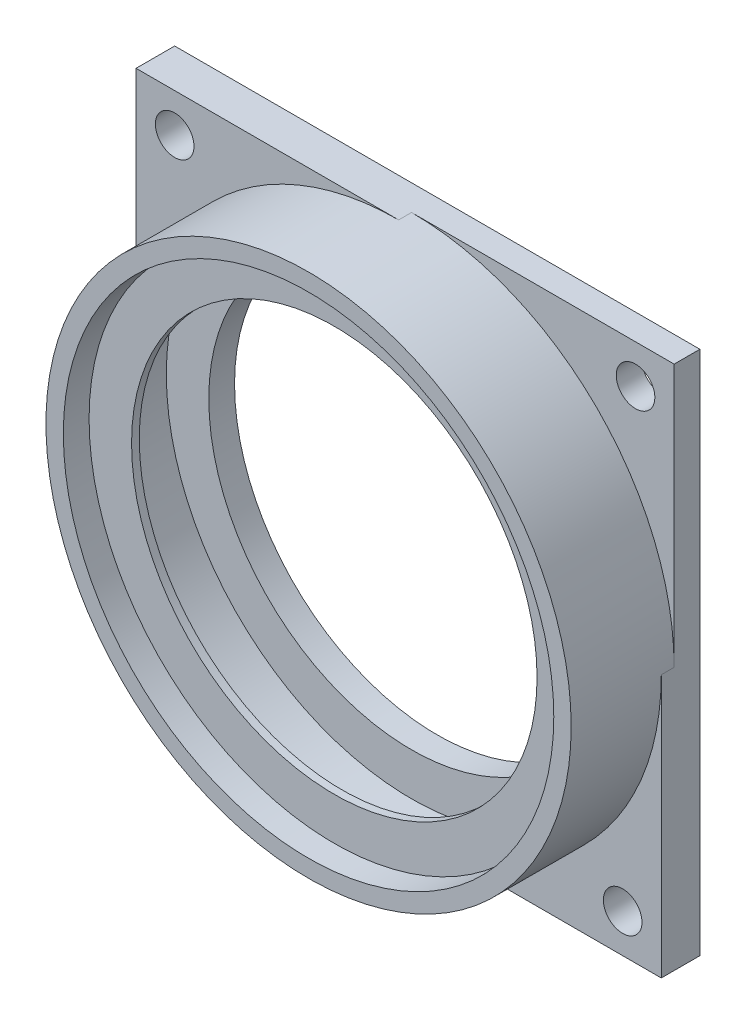
ISO-10303-21;
HEADER;
FILE_DESCRIPTION(('STEP AP214'),'2;1');
FILE_NAME('part.step','',(''),(''),'','','');
FILE_SCHEMA(('AUTOMOTIVE_DESIGN { 1 0 10303 214 1 1 1 1 }'));
ENDSEC;
DATA;
#1=APPLICATION_CONTEXT('core data for automotive mechanical design processes');
#2=APPLICATION_PROTOCOL_DEFINITION('international standard','automotive_design',2000,#1);
#3=PRODUCT_CONTEXT('',#1,'mechanical');
#4=PRODUCT('Part','Part','',(#3));
#5=PRODUCT_RELATED_PRODUCT_CATEGORY('part','',(#4));
#6=PRODUCT_DEFINITION_FORMATION('','',#4);
#7=PRODUCT_DEFINITION_CONTEXT('part definition',#1,'design');
#8=PRODUCT_DEFINITION('design','',#6,#7);
#9=PRODUCT_DEFINITION_SHAPE('','',#8);
#10=(LENGTH_UNIT() NAMED_UNIT(*) SI_UNIT(.MILLI.,.METRE.));
#11=(NAMED_UNIT(*) PLANE_ANGLE_UNIT() SI_UNIT($,.RADIAN.));
#12=(NAMED_UNIT(*) SI_UNIT($,.STERADIAN.) SOLID_ANGLE_UNIT());
#13=UNCERTAINTY_MEASURE_WITH_UNIT(LENGTH_MEASURE(1.E-05),#10,'distance_accuracy_value','');
#14=(GEOMETRIC_REPRESENTATION_CONTEXT(3) GLOBAL_UNCERTAINTY_ASSIGNED_CONTEXT((#13)) GLOBAL_UNIT_ASSIGNED_CONTEXT((#10,
#11,#12)) REPRESENTATION_CONTEXT('',''));
#15=CARTESIAN_POINT('',(0.,0.,0.));
#16=DIRECTION('',(0.,0.,1.));
#17=DIRECTION('',(1.,0.,0.));
#18=AXIS2_PLACEMENT_3D('',#15,#16,#17);
#19=CARTESIAN_POINT('',(20.4,0.,5.));
#20=DIRECTION('',(-1.,0.,0.));
#21=DIRECTION('',(0.,0.,1.));
#22=AXIS2_PLACEMENT_3D('',#19,#20,#21);
#23=PLANE('',#22);
#24=DIRECTION('',(0.,1.,0.));
#25=VECTOR('',#24,1.);
#26=CARTESIAN_POINT('',(20.4,0.,3.));
#27=LINE('',#26,#25);
#28=CARTESIAN_POINT('',(20.4,-20.4,3.));
#29=VERTEX_POINT('',#28);
#30=CARTESIAN_POINT('',(20.4,0.,3.));
#31=VERTEX_POINT('',#30);
#32=EDGE_CURVE('E190',#29,#31,#27,.T.);
#33=ORIENTED_EDGE('',*,*,#32,.F.);
#34=DIRECTION('',(0.,0.,-1.));
#35=VECTOR('',#34,1.);
#36=CARTESIAN_POINT('',(20.4,-20.4,5.));
#37=LINE('',#36,#35);
#38=CARTESIAN_POINT('',(20.4,-20.4,0.));
#39=VERTEX_POINT('',#38);
#40=EDGE_CURVE('E13',#29,#39,#37,.T.);
#41=ORIENTED_EDGE('',*,*,#40,.T.);
#42=DIRECTION('',(0.,1.,0.));
#43=VECTOR('',#42,1.);
#44=CARTESIAN_POINT('',(20.4,0.,0.));
#45=LINE('',#44,#43);
#46=CARTESIAN_POINT('',(20.4,20.4,0.));
#47=VERTEX_POINT('',#46);
#48=EDGE_CURVE('E220',#39,#47,#45,.T.);
#49=ORIENTED_EDGE('',*,*,#48,.T.);
#50=DIRECTION('',(0.,0.,-1.));
#51=VECTOR('',#50,1.);
#52=CARTESIAN_POINT('',(20.4,20.4,5.));
#53=LINE('',#52,#51);
#54=CARTESIAN_POINT('',(20.4,20.4,2.));
#55=VERTEX_POINT('',#54);
#56=EDGE_CURVE('E125',#55,#47,#53,.T.);
#57=ORIENTED_EDGE('',*,*,#56,.F.);
#58=DIRECTION('',(0.,1.,0.));
#59=VECTOR('',#58,1.);
#60=CARTESIAN_POINT('',(20.4,0.,2.));
#61=LINE('',#60,#59);
#62=CARTESIAN_POINT('',(20.4,0.,2.));
#63=VERTEX_POINT('',#62);
#64=EDGE_CURVE('E270',#63,#55,#61,.T.);
#65=ORIENTED_EDGE('',*,*,#64,.F.);
#66=DIRECTION('',(0.,0.,-1.));
#67=VECTOR('',#66,1.);
#68=CARTESIAN_POINT('',(20.4,0.,11.));
#69=LINE('',#68,#67);
#70=EDGE_CURVE('E218',#31,#63,#69,.T.);
#71=ORIENTED_EDGE('',*,*,#70,.F.);
#72=EDGE_LOOP('',(#33,#41,#49,#57,#65,#71));
#73=FACE_BOUND('',#72,.T.);
#74=ADVANCED_FACE('F116',(#73),#23,.F.);
#75=CARTESIAN_POINT('',(0.,20.4,5.));
#76=DIRECTION('',(0.,1.,0.));
#77=DIRECTION('',(0.,0.,1.));
#78=AXIS2_PLACEMENT_3D('',#75,#76,#77);
#79=PLANE('',#78);
#80=DIRECTION('',(0.,0.,-1.));
#81=VECTOR('',#80,1.);
#82=CARTESIAN_POINT('',(-20.4,20.4,5.));
#83=LINE('',#82,#81);
#84=CARTESIAN_POINT('',(-20.4,20.4,3.));
#85=VERTEX_POINT('',#84);
#86=CARTESIAN_POINT('',(-20.4,20.4,0.));
#87=VERTEX_POINT('',#86);
#88=EDGE_CURVE('E141',#85,#87,#83,.T.);
#89=ORIENTED_EDGE('',*,*,#88,.F.);
#90=DIRECTION('',(-1.,0.,0.));
#91=VECTOR('',#90,1.);
#92=CARTESIAN_POINT('',(0.,20.4,3.));
#93=LINE('',#92,#91);
#94=CARTESIAN_POINT('',(0.,20.4,3.));
#95=VERTEX_POINT('',#94);
#96=EDGE_CURVE('E293',#95,#85,#93,.T.);
#97=ORIENTED_EDGE('',*,*,#96,.F.);
#98=DIRECTION('',(0.,0.,-1.));
#99=VECTOR('',#98,1.);
#100=CARTESIAN_POINT('',(0.,20.4,11.));
#101=LINE('',#100,#99);
#102=CARTESIAN_POINT('',(0.,20.4,2.));
#103=VERTEX_POINT('',#102);
#104=EDGE_CURVE('E208',#95,#103,#101,.T.);
#105=ORIENTED_EDGE('',*,*,#104,.T.);
#106=DIRECTION('',(-1.,0.,0.));
#107=VECTOR('',#106,1.);
#108=CARTESIAN_POINT('',(20.4,20.4,2.));
#109=LINE('',#108,#107);
#110=EDGE_CURVE('E248',#55,#103,#109,.T.);
#111=ORIENTED_EDGE('',*,*,#110,.F.);
#112=ORIENTED_EDGE('',*,*,#56,.T.);
#113=DIRECTION('',(1.,0.,0.));
#114=VECTOR('',#113,1.);
#115=CARTESIAN_POINT('',(0.,20.4,0.));
#116=LINE('',#115,#114);
#117=EDGE_CURVE('E223',#87,#47,#116,.T.);
#118=ORIENTED_EDGE('',*,*,#117,.F.);
#119=EDGE_LOOP('',(#89,#97,#105,#111,#112,#118));
#120=FACE_BOUND('',#119,.T.);
#121=ADVANCED_FACE('F246',(#120),#79,.T.);
#122=CARTESIAN_POINT('',(0.,-20.4,5.));
#123=DIRECTION('',(0.,1.,0.));
#124=DIRECTION('',(0.,0.,1.));
#125=AXIS2_PLACEMENT_3D('',#122,#123,#124);
#126=PLANE('',#125);
#127=DIRECTION('',(1.,0.,0.));
#128=VECTOR('',#127,1.);
#129=CARTESIAN_POINT('',(0.,-20.4,3.));
#130=LINE('',#129,#128);
#131=CARTESIAN_POINT('',(0.,-20.4,3.));
#132=VERTEX_POINT('',#131);
#133=EDGE_CURVE('E188',#132,#29,#130,.T.);
#134=ORIENTED_EDGE('',*,*,#133,.F.);
#135=DIRECTION('',(0.,0.,-1.));
#136=VECTOR('',#135,1.);
#137=CARTESIAN_POINT('',(0.,-20.4,11.));
#138=LINE('',#137,#136);
#139=CARTESIAN_POINT('',(0.,-20.4,2.));
#140=VERTEX_POINT('',#139);
#141=EDGE_CURVE('E197',#132,#140,#138,.T.);
#142=ORIENTED_EDGE('',*,*,#141,.T.);
#143=DIRECTION('',(1.,0.,0.));
#144=VECTOR('',#143,1.);
#145=CARTESIAN_POINT('',(-20.4,-20.4,2.));
#146=LINE('',#145,#144);
#147=CARTESIAN_POINT('',(-20.4,-20.4,2.));
#148=VERTEX_POINT('',#147);
#149=EDGE_CURVE('E260',#148,#140,#146,.T.);
#150=ORIENTED_EDGE('',*,*,#149,.F.);
#151=DIRECTION('',(0.,0.,-1.));
#152=VECTOR('',#151,1.);
#153=CARTESIAN_POINT('',(-20.4,-20.4,5.));
#154=LINE('',#153,#152);
#155=CARTESIAN_POINT('',(-20.4,-20.4,0.));
#156=VERTEX_POINT('',#155);
#157=EDGE_CURVE('E133',#148,#156,#154,.T.);
#158=ORIENTED_EDGE('',*,*,#157,.T.);
#159=DIRECTION('',(1.,0.,0.));
#160=VECTOR('',#159,1.);
#161=CARTESIAN_POINT('',(0.,-20.4,0.));
#162=LINE('',#161,#160);
#163=EDGE_CURVE('E217',#156,#39,#162,.T.);
#164=ORIENTED_EDGE('',*,*,#163,.T.);
#165=ORIENTED_EDGE('',*,*,#40,.F.);
#166=EDGE_LOOP('',(#134,#142,#150,#158,#164,#165));
#167=FACE_BOUND('',#166,.T.);
#168=ADVANCED_FACE('F196',(#167),#126,.F.);
#169=CARTESIAN_POINT('',(-17.4,17.4,5.));
#170=DIRECTION('',(0.,0.,-1.));
#171=DIRECTION('',(-1.,0.,0.));
#172=AXIS2_PLACEMENT_3D('',#169,#170,#171);
#173=CYLINDRICAL_SURFACE('',#172,1.5);
#174=CARTESIAN_POINT('',(-17.4,17.4,0.));
#175=DIRECTION('',(0.,0.,1.));
#176=DIRECTION('',(1.,0.,0.));
#177=AXIS2_PLACEMENT_3D('',#174,#175,#176);
#178=CIRCLE('',#177,1.5);
#179=CARTESIAN_POINT('',(-15.9,17.4,0.));
#180=VERTEX_POINT('',#179);
#181=EDGE_CURVE('E235',#180,#180,#178,.T.);
#182=ORIENTED_EDGE('',*,*,#181,.F.);
#183=EDGE_LOOP('',(#182));
#184=FACE_BOUND('',#183,.T.);
#185=CARTESIAN_POINT('',(-17.4,17.4,3.));
#186=DIRECTION('',(0.,0.,1.));
#187=DIRECTION('',(1.,0.,0.));
#188=AXIS2_PLACEMENT_3D('',#185,#186,#187);
#189=CIRCLE('',#188,1.5);
#190=CARTESIAN_POINT('',(-15.9,17.4,3.));
#191=VERTEX_POINT('',#190);
#192=EDGE_CURVE('E304',#191,#191,#189,.T.);
#193=ORIENTED_EDGE('',*,*,#192,.T.);
#194=EDGE_LOOP('',(#193));
#195=FACE_BOUND('',#194,.T.);
#196=ADVANCED_FACE('F338',(#184,#195),#173,.F.);
#197=CARTESIAN_POINT('',(17.4,-17.4,5.));
#198=DIRECTION('',(0.,0.,-1.));
#199=DIRECTION('',(-1.,0.,0.));
#200=AXIS2_PLACEMENT_3D('',#197,#198,#199);
#201=CYLINDRICAL_SURFACE('',#200,1.5);
#202=CARTESIAN_POINT('',(17.4,-17.4,0.));
#203=DIRECTION('',(0.,0.,1.));
#204=DIRECTION('',(1.,0.,0.));
#205=AXIS2_PLACEMENT_3D('',#202,#203,#204);
#206=CIRCLE('',#205,1.5);
#207=CARTESIAN_POINT('',(18.9,-17.4,0.));
#208=VERTEX_POINT('',#207);
#209=EDGE_CURVE('E229',#208,#208,#206,.T.);
#210=ORIENTED_EDGE('',*,*,#209,.F.);
#211=EDGE_LOOP('',(#210));
#212=FACE_BOUND('',#211,.T.);
#213=CARTESIAN_POINT('',(17.4,-17.4,3.));
#214=DIRECTION('',(0.,0.,1.));
#215=DIRECTION('',(1.,0.,0.));
#216=AXIS2_PLACEMENT_3D('',#213,#214,#215);
#217=CIRCLE('',#216,1.5);
#218=CARTESIAN_POINT('',(18.9,-17.4,3.));
#219=VERTEX_POINT('',#218);
#220=EDGE_CURVE('E307',#219,#219,#217,.T.);
#221=ORIENTED_EDGE('',*,*,#220,.T.);
#222=EDGE_LOOP('',(#221));
#223=FACE_BOUND('',#222,.T.);
#224=ADVANCED_FACE('F342',(#212,#223),#201,.F.);
#225=CARTESIAN_POINT('',(-20.4,0.,5.));
#226=DIRECTION('',(-1.,0.,0.));
#227=DIRECTION('',(0.,0.,1.));
#228=AXIS2_PLACEMENT_3D('',#225,#226,#227);
#229=PLANE('',#228);
#230=DIRECTION('',(0.,0.,-1.));
#231=VECTOR('',#230,1.);
#232=CARTESIAN_POINT('',(-20.4,0.,11.));
#233=LINE('',#232,#231);
#234=CARTESIAN_POINT('',(-20.4,0.,3.));
#235=VERTEX_POINT('',#234);
#236=CARTESIAN_POINT('',(-20.4,0.,2.));
#237=VERTEX_POINT('',#236);
#238=EDGE_CURVE('E205',#235,#237,#233,.T.);
#239=ORIENTED_EDGE('',*,*,#238,.F.);
#240=DIRECTION('',(0.,-1.,0.));
#241=VECTOR('',#240,1.);
#242=CARTESIAN_POINT('',(-20.4,0.,3.));
#243=LINE('',#242,#241);
#244=EDGE_CURVE('E296',#85,#235,#243,.T.);
#245=ORIENTED_EDGE('',*,*,#244,.F.);
#246=ORIENTED_EDGE('',*,*,#88,.T.);
#247=DIRECTION('',(0.,1.,0.));
#248=VECTOR('',#247,1.);
#249=CARTESIAN_POINT('',(-20.4,0.,0.));
#250=LINE('',#249,#248);
#251=EDGE_CURVE('E226',#156,#87,#250,.T.);
#252=ORIENTED_EDGE('',*,*,#251,.F.);
#253=ORIENTED_EDGE('',*,*,#157,.F.);
#254=DIRECTION('',(0.,-1.,0.));
#255=VECTOR('',#254,1.);
#256=CARTESIAN_POINT('',(-20.4,0.,2.));
#257=LINE('',#256,#255);
#258=EDGE_CURVE('E258',#237,#148,#257,.T.);
#259=ORIENTED_EDGE('',*,*,#258,.F.);
#260=EDGE_LOOP('',(#239,#245,#246,#252,#253,#259));
#261=FACE_BOUND('',#260,.T.);
#262=ADVANCED_FACE('F256',(#261),#229,.T.);
#263=CARTESIAN_POINT('',(0.,0.,10.));
#264=DIRECTION('',(0.,0.,1.));
#265=DIRECTION('',(1.,0.,0.));
#266=AXIS2_PLACEMENT_3D('',#263,#264,#265);
#267=PLANE('',#266);
#268=CARTESIAN_POINT('',(0.,0.,10.));
#269=DIRECTION('',(0.,0.,1.));
#270=DIRECTION('',(1.,0.,0.));
#271=AXIS2_PLACEMENT_3D('',#268,#269,#270);
#272=CIRCLE('',#271,20.4);
#273=CARTESIAN_POINT('',(20.4,0.,10.));
#274=VERTEX_POINT('',#273);
#275=EDGE_CURVE('E264',#274,#274,#272,.T.);
#276=ORIENTED_EDGE('',*,*,#275,.T.);
#277=EDGE_LOOP('',(#276));
#278=FACE_BOUND('',#277,.T.);
#279=CARTESIAN_POINT('',(0.,0.,10.));
#280=DIRECTION('',(0.,0.,1.));
#281=DIRECTION('',(1.,0.,0.));
#282=AXIS2_PLACEMENT_3D('',#279,#280,#281);
#283=CIRCLE('',#282,19.05);
#284=CARTESIAN_POINT('',(19.05,0.,10.));
#285=VERTEX_POINT('',#284);
#286=EDGE_CURVE('E310',#285,#285,#283,.T.);
#287=ORIENTED_EDGE('',*,*,#286,.F.);
#288=EDGE_LOOP('',(#287));
#289=FACE_BOUND('',#288,.T.);
#290=ADVANCED_FACE('F315',(#278,#289),#267,.T.);
#291=CARTESIAN_POINT('',(0.,0.,11.));
#292=DIRECTION('',(0.,0.,-1.));
#293=DIRECTION('',(-1.,0.,0.));
#294=AXIS2_PLACEMENT_3D('',#291,#292,#293);
#295=CYLINDRICAL_SURFACE('',#294,20.4);
#296=CARTESIAN_POINT('',(0.,0.,3.));
#297=DIRECTION('',(0.,0.,1.));
#298=DIRECTION('',(1.,0.,0.));
#299=AXIS2_PLACEMENT_3D('',#296,#297,#298);
#300=CIRCLE('',#299,20.4);
#301=EDGE_CURVE('E185',#132,#31,#300,.T.);
#302=ORIENTED_EDGE('',*,*,#301,.T.);
#303=ORIENTED_EDGE('',*,*,#70,.T.);
#304=CARTESIAN_POINT('',(0.,0.,2.));
#305=DIRECTION('',(0.,0.,-1.));
#306=DIRECTION('',(1.,0.,0.));
#307=AXIS2_PLACEMENT_3D('',#304,#305,#306);
#308=CIRCLE('',#307,20.4);
#309=EDGE_CURVE('E262',#103,#63,#308,.T.);
#310=ORIENTED_EDGE('',*,*,#309,.F.);
#311=ORIENTED_EDGE('',*,*,#104,.F.);
#312=CARTESIAN_POINT('',(0.,0.,3.));
#313=DIRECTION('',(0.,0.,1.));
#314=DIRECTION('',(1.,0.,0.));
#315=AXIS2_PLACEMENT_3D('',#312,#313,#314);
#316=CIRCLE('',#315,20.4);
#317=EDGE_CURVE('E299',#235,#95,#316,.F.);
#318=ORIENTED_EDGE('',*,*,#317,.F.);
#319=ORIENTED_EDGE('',*,*,#238,.T.);
#320=CARTESIAN_POINT('',(0.,0.,2.));
#321=DIRECTION('',(0.,0.,-1.));
#322=DIRECTION('',(1.,0.,0.));
#323=AXIS2_PLACEMENT_3D('',#320,#321,#322);
#324=CIRCLE('',#323,20.4);
#325=EDGE_CURVE('E203',#140,#237,#324,.T.);
#326=ORIENTED_EDGE('',*,*,#325,.F.);
#327=ORIENTED_EDGE('',*,*,#141,.F.);
#328=EDGE_LOOP('',(#302,#303,#310,#311,#318,#319,#326,#327));
#329=FACE_BOUND('',#328,.T.);
#330=ORIENTED_EDGE('',*,*,#275,.F.);
#331=EDGE_LOOP('',(#330));
#332=FACE_BOUND('',#331,.T.);
#333=ADVANCED_FACE('F200',(#329,#332),#295,.T.);
#334=CARTESIAN_POINT('',(0.,0.,8.));
#335=DIRECTION('',(0.,0.,1.));
#336=DIRECTION('',(1.,0.,0.));
#337=AXIS2_PLACEMENT_3D('',#334,#335,#336);
#338=CYLINDRICAL_SURFACE('',#337,19.05);
#339=CARTESIAN_POINT('',(0.,0.,8.));
#340=DIRECTION('',(0.,0.,1.));
#341=DIRECTION('',(1.,0.,0.));
#342=AXIS2_PLACEMENT_3D('',#339,#340,#341);
#343=CIRCLE('',#342,19.05);
#344=CARTESIAN_POINT('',(19.05,0.,8.));
#345=VERTEX_POINT('',#344);
#346=EDGE_CURVE('E211',#345,#345,#343,.T.);
#347=ORIENTED_EDGE('',*,*,#346,.F.);
#348=EDGE_LOOP('',(#347));
#349=FACE_BOUND('',#348,.T.);
#350=ORIENTED_EDGE('',*,*,#286,.T.);
#351=EDGE_LOOP('',(#350));
#352=FACE_BOUND('',#351,.T.);
#353=ADVANCED_FACE('F318',(#349,#352),#338,.F.);
#354=CARTESIAN_POINT('',(-17.4,-17.4,5.));
#355=DIRECTION('',(0.,0.,-1.));
#356=DIRECTION('',(-1.,0.,0.));
#357=AXIS2_PLACEMENT_3D('',#354,#355,#356);
#358=CYLINDRICAL_SURFACE('',#357,1.5);
#359=CARTESIAN_POINT('',(-17.4,-17.4,0.));
#360=DIRECTION('',(0.,0.,1.));
#361=DIRECTION('',(1.,0.,0.));
#362=AXIS2_PLACEMENT_3D('',#359,#360,#361);
#363=CIRCLE('',#362,1.5);
#364=CARTESIAN_POINT('',(-15.9,-17.4,0.));
#365=VERTEX_POINT('',#364);
#366=EDGE_CURVE('E232',#365,#365,#363,.T.);
#367=ORIENTED_EDGE('',*,*,#366,.F.);
#368=EDGE_LOOP('',(#367));
#369=FACE_BOUND('',#368,.T.);
#370=CARTESIAN_POINT('',(-17.4,-17.4,2.));
#371=DIRECTION('',(0.,0.,1.));
#372=DIRECTION('',(1.,0.,0.));
#373=AXIS2_PLACEMENT_3D('',#370,#371,#372);
#374=CIRCLE('',#373,1.5);
#375=CARTESIAN_POINT('',(-15.9,-17.4,2.));
#376=VERTEX_POINT('',#375);
#377=EDGE_CURVE('E273',#376,#376,#374,.T.);
#378=ORIENTED_EDGE('',*,*,#377,.T.);
#379=EDGE_LOOP('',(#378));
#380=FACE_BOUND('',#379,.T.);
#381=ADVANCED_FACE('F325',(#369,#380),#358,.F.);
#382=CARTESIAN_POINT('',(17.4,17.4,5.));
#383=DIRECTION('',(0.,0.,-1.));
#384=DIRECTION('',(-1.,0.,0.));
#385=AXIS2_PLACEMENT_3D('',#382,#383,#384);
#386=CYLINDRICAL_SURFACE('',#385,1.5);
#387=CARTESIAN_POINT('',(17.4,17.4,0.));
#388=DIRECTION('',(0.,0.,1.));
#389=DIRECTION('',(1.,0.,0.));
#390=AXIS2_PLACEMENT_3D('',#387,#388,#389);
#391=CIRCLE('',#390,1.5);
#392=CARTESIAN_POINT('',(18.9,17.4,0.));
#393=VERTEX_POINT('',#392);
#394=EDGE_CURVE('E238',#393,#393,#391,.T.);
#395=ORIENTED_EDGE('',*,*,#394,.F.);
#396=EDGE_LOOP('',(#395));
#397=FACE_BOUND('',#396,.T.);
#398=CARTESIAN_POINT('',(17.4,17.4,2.));
#399=DIRECTION('',(0.,0.,1.));
#400=DIRECTION('',(1.,0.,0.));
#401=AXIS2_PLACEMENT_3D('',#398,#399,#400);
#402=CIRCLE('',#401,1.5);
#403=CARTESIAN_POINT('',(18.9,17.4,2.));
#404=VERTEX_POINT('',#403);
#405=EDGE_CURVE('E120',#404,#404,#402,.T.);
#406=ORIENTED_EDGE('',*,*,#405,.T.);
#407=EDGE_LOOP('',(#406));
#408=FACE_BOUND('',#407,.T.);
#409=ADVANCED_FACE('F354',(#397,#408),#386,.F.);
#410=CARTESIAN_POINT('',(0.,0.,5.));
#411=DIRECTION('',(0.,0.,-1.));
#412=DIRECTION('',(-1.,0.,0.));
#413=AXIS2_PLACEMENT_3D('',#410,#411,#412);
#414=CYLINDRICAL_SURFACE('',#413,15.75);
#415=CARTESIAN_POINT('',(0.,0.,2.));
#416=DIRECTION('',(0.,0.,-1.));
#417=DIRECTION('',(-1.,0.,0.));
#418=AXIS2_PLACEMENT_3D('',#415,#416,#417);
#419=CIRCLE('',#418,15.75);
#420=CARTESIAN_POINT('',(-15.75,0.,2.));
#421=VERTEX_POINT('',#420);
#422=EDGE_CURVE('E281',#421,#421,#419,.T.);
#423=ORIENTED_EDGE('',*,*,#422,.F.);
#424=EDGE_LOOP('',(#423));
#425=FACE_BOUND('',#424,.T.);
#426=CARTESIAN_POINT('',(0.,0.,0.));
#427=DIRECTION('',(0.,0.,1.));
#428=DIRECTION('',(1.,0.,0.));
#429=AXIS2_PLACEMENT_3D('',#426,#427,#428);
#430=CIRCLE('',#429,15.75);
#431=CARTESIAN_POINT('',(15.75,0.,0.));
#432=VERTEX_POINT('',#431);
#433=EDGE_CURVE('E214',#432,#432,#430,.T.);
#434=ORIENTED_EDGE('',*,*,#433,.F.);
#435=EDGE_LOOP('',(#434));
#436=FACE_BOUND('',#435,.T.);
#437=ADVANCED_FACE('F461',(#425,#436),#414,.F.);
#438=CARTESIAN_POINT('',(0.,0.,7.4));
#439=DIRECTION('',(0.,0.,1.));
#440=DIRECTION('',(1.,0.,0.));
#441=AXIS2_PLACEMENT_3D('',#438,#439,#440);
#442=CIRCLE('',#441,15.75);
#443=CARTESIAN_POINT('',(15.75,0.,7.4));
#444=VERTEX_POINT('',#443);
#445=EDGE_CURVE('E280',#444,#444,#442,.F.);
#446=ORIENTED_EDGE('',*,*,#445,.T.);
#447=EDGE_LOOP('',(#446));
#448=FACE_BOUND('',#447,.T.);
#449=CARTESIAN_POINT('',(0.,0.,8.));
#450=DIRECTION('',(0.,0.,1.));
#451=DIRECTION('',(1.,0.,0.));
#452=AXIS2_PLACEMENT_3D('',#449,#450,#451);
#453=CIRCLE('',#452,15.75);
#454=CARTESIAN_POINT('',(15.75,0.,8.));
#455=VERTEX_POINT('',#454);
#456=EDGE_CURVE('E206',#455,#455,#453,.T.);
#457=ORIENTED_EDGE('',*,*,#456,.T.);
#458=EDGE_LOOP('',(#457));
#459=FACE_BOUND('',#458,.T.);
#460=ADVANCED_FACE('F118',(#448,#459),#414,.F.);
#461=CARTESIAN_POINT('',(0.,0.,0.));
#462=DIRECTION('',(0.,0.,1.));
#463=DIRECTION('',(1.,0.,0.));
#464=AXIS2_PLACEMENT_3D('',#461,#462,#463);
#465=PLANE('',#464);
#466=ORIENTED_EDGE('',*,*,#433,.T.);
#467=EDGE_LOOP('',(#466));
#468=FACE_BOUND('',#467,.T.);
#469=ORIENTED_EDGE('',*,*,#163,.F.);
#470=ORIENTED_EDGE('',*,*,#251,.T.);
#471=ORIENTED_EDGE('',*,*,#117,.T.);
#472=ORIENTED_EDGE('',*,*,#48,.F.);
#473=EDGE_LOOP('',(#469,#470,#471,#472));
#474=FACE_BOUND('',#473,.T.);
#475=ORIENTED_EDGE('',*,*,#209,.T.);
#476=EDGE_LOOP('',(#475));
#477=FACE_BOUND('',#476,.T.);
#478=ORIENTED_EDGE('',*,*,#366,.T.);
#479=EDGE_LOOP('',(#478));
#480=FACE_BOUND('',#479,.T.);
#481=ORIENTED_EDGE('',*,*,#181,.T.);
#482=EDGE_LOOP('',(#481));
#483=FACE_BOUND('',#482,.T.);
#484=ORIENTED_EDGE('',*,*,#394,.T.);
#485=EDGE_LOOP('',(#484));
#486=FACE_BOUND('',#485,.T.);
#487=ADVANCED_FACE('F253',(#468,#474,#477,#480,#483,#486),#465,.F.);
#488=CARTESIAN_POINT('',(0.,0.,8.));
#489=DIRECTION('',(0.,0.,1.));
#490=DIRECTION('',(1.,0.,0.));
#491=AXIS2_PLACEMENT_3D('',#488,#489,#490);
#492=PLANE('',#491);
#493=ORIENTED_EDGE('',*,*,#456,.F.);
#494=EDGE_LOOP('',(#493));
#495=FACE_BOUND('',#494,.T.);
#496=ORIENTED_EDGE('',*,*,#346,.T.);
#497=EDGE_LOOP('',(#496));
#498=FACE_BOUND('',#497,.T.);
#499=ADVANCED_FACE('F442',(#495,#498),#492,.T.);
#500=CARTESIAN_POINT('',(0.,0.,61.8815367264149));
#501=DIRECTION('',(0.,0.,-1.));
#502=DIRECTION('',(-1.,0.,0.));
#503=AXIS2_PLACEMENT_3D('',#500,#501,#502);
#504=CYLINDRICAL_SURFACE('',#503,19.05);
#505=CARTESIAN_POINT('',(0.,0.,2.));
#506=DIRECTION('',(0.,0.,-1.));
#507=DIRECTION('',(-1.,0.,0.));
#508=AXIS2_PLACEMENT_3D('',#505,#506,#507);
#509=CIRCLE('',#508,19.05);
#510=CARTESIAN_POINT('',(-19.05,0.,2.));
#511=VERTEX_POINT('',#510);
#512=EDGE_CURVE('E277',#511,#511,#509,.T.);
#513=ORIENTED_EDGE('',*,*,#512,.T.);
#514=EDGE_LOOP('',(#513));
#515=FACE_BOUND('',#514,.T.);
#516=CARTESIAN_POINT('',(0.,0.,7.4));
#517=DIRECTION('',(0.,0.,1.));
#518=DIRECTION('',(1.,0.,0.));
#519=AXIS2_PLACEMENT_3D('',#516,#517,#518);
#520=CIRCLE('',#519,19.05);
#521=CARTESIAN_POINT('',(19.05,0.,7.4));
#522=VERTEX_POINT('',#521);
#523=EDGE_CURVE('E276',#522,#522,#520,.F.);
#524=ORIENTED_EDGE('',*,*,#523,.F.);
#525=EDGE_LOOP('',(#524));
#526=FACE_BOUND('',#525,.T.);
#527=ADVANCED_FACE('F438',(#515,#526),#504,.F.);
#528=CARTESIAN_POINT('',(0.,0.,2.));
#529=DIRECTION('',(0.,0.,-1.));
#530=DIRECTION('',(-1.,0.,0.));
#531=AXIS2_PLACEMENT_3D('',#528,#529,#530);
#532=PLANE('',#531);
#533=ORIENTED_EDGE('',*,*,#422,.T.);
#534=EDGE_LOOP('',(#533));
#535=FACE_BOUND('',#534,.T.);
#536=ORIENTED_EDGE('',*,*,#512,.F.);
#537=EDGE_LOOP('',(#536));
#538=FACE_BOUND('',#537,.T.);
#539=ADVANCED_FACE('F435',(#535,#538),#532,.F.);
#540=CARTESIAN_POINT('',(0.,0.,7.4));
#541=DIRECTION('',(0.,0.,1.));
#542=DIRECTION('',(1.,0.,0.));
#543=AXIS2_PLACEMENT_3D('',#540,#541,#542);
#544=PLANE('',#543);
#545=ORIENTED_EDGE('',*,*,#523,.T.);
#546=EDGE_LOOP('',(#545));
#547=FACE_BOUND('',#546,.T.);
#548=ORIENTED_EDGE('',*,*,#445,.F.);
#549=EDGE_LOOP('',(#548));
#550=FACE_BOUND('',#549,.T.);
#551=ADVANCED_FACE('F430',(#547,#550),#544,.F.);
#552=CARTESIAN_POINT('',(0.,0.,2.));
#553=DIRECTION('',(0.,0.,1.));
#554=DIRECTION('',(1.,0.,0.));
#555=AXIS2_PLACEMENT_3D('',#552,#553,#554);
#556=PLANE('',#555);
#557=ORIENTED_EDGE('',*,*,#377,.F.);
#558=EDGE_LOOP('',(#557));
#559=FACE_BOUND('',#558,.T.);
#560=ORIENTED_EDGE('',*,*,#325,.T.);
#561=ORIENTED_EDGE('',*,*,#258,.T.);
#562=ORIENTED_EDGE('',*,*,#149,.T.);
#563=EDGE_LOOP('',(#560,#561,#562));
#564=FACE_BOUND('',#563,.T.);
#565=ADVANCED_FACE('F427',(#559,#564),#556,.T.);
#566=CARTESIAN_POINT('',(0.,0.,2.));
#567=DIRECTION('',(0.,0.,1.));
#568=DIRECTION('',(1.,0.,0.));
#569=AXIS2_PLACEMENT_3D('',#566,#567,#568);
#570=PLANE('',#569);
#571=ORIENTED_EDGE('',*,*,#405,.F.);
#572=EDGE_LOOP('',(#571));
#573=FACE_BOUND('',#572,.T.);
#574=ORIENTED_EDGE('',*,*,#309,.T.);
#575=ORIENTED_EDGE('',*,*,#64,.T.);
#576=ORIENTED_EDGE('',*,*,#110,.T.);
#577=EDGE_LOOP('',(#574,#575,#576));
#578=FACE_BOUND('',#577,.T.);
#579=ADVANCED_FACE('F295',(#573,#578),#570,.T.);
#580=CARTESIAN_POINT('',(0.,0.,3.));
#581=DIRECTION('',(0.,0.,1.));
#582=DIRECTION('',(1.,0.,0.));
#583=AXIS2_PLACEMENT_3D('',#580,#581,#582);
#584=PLANE('',#583);
#585=ORIENTED_EDGE('',*,*,#192,.F.);
#586=EDGE_LOOP('',(#585));
#587=FACE_BOUND('',#586,.T.);
#588=ORIENTED_EDGE('',*,*,#244,.T.);
#589=ORIENTED_EDGE('',*,*,#317,.T.);
#590=ORIENTED_EDGE('',*,*,#96,.T.);
#591=EDGE_LOOP('',(#588,#589,#590));
#592=FACE_BOUND('',#591,.T.);
#593=ADVANCED_FACE('F408',(#587,#592),#584,.T.);
#594=CARTESIAN_POINT('',(0.,0.,3.));
#595=DIRECTION('',(0.,0.,1.));
#596=DIRECTION('',(1.,0.,0.));
#597=AXIS2_PLACEMENT_3D('',#594,#595,#596);
#598=PLANE('',#597);
#599=ORIENTED_EDGE('',*,*,#220,.F.);
#600=EDGE_LOOP('',(#599));
#601=FACE_BOUND('',#600,.T.);
#602=ORIENTED_EDGE('',*,*,#301,.F.);
#603=ORIENTED_EDGE('',*,*,#133,.T.);
#604=ORIENTED_EDGE('',*,*,#32,.T.);
#605=EDGE_LOOP('',(#602,#603,#604));
#606=FACE_BOUND('',#605,.T.);
#607=ADVANCED_FACE('F187',(#601,#606),#598,.T.);
#608=CLOSED_SHELL('',(#74,#121,#168,#196,#224,#262,#290,#333,#353,#381,#409,#437,#460,#487,#499,
#527,#539,#551,#565,#579,#593,#607));
#609=MANIFOLD_SOLID_BREP('B2',#608);
#610=ADVANCED_BREP_SHAPE_REPRESENTATION('',(#18,#609),#14);
#611=SHAPE_DEFINITION_REPRESENTATION(#9,#610);
ENDSEC;
END-ISO-10303-21;
